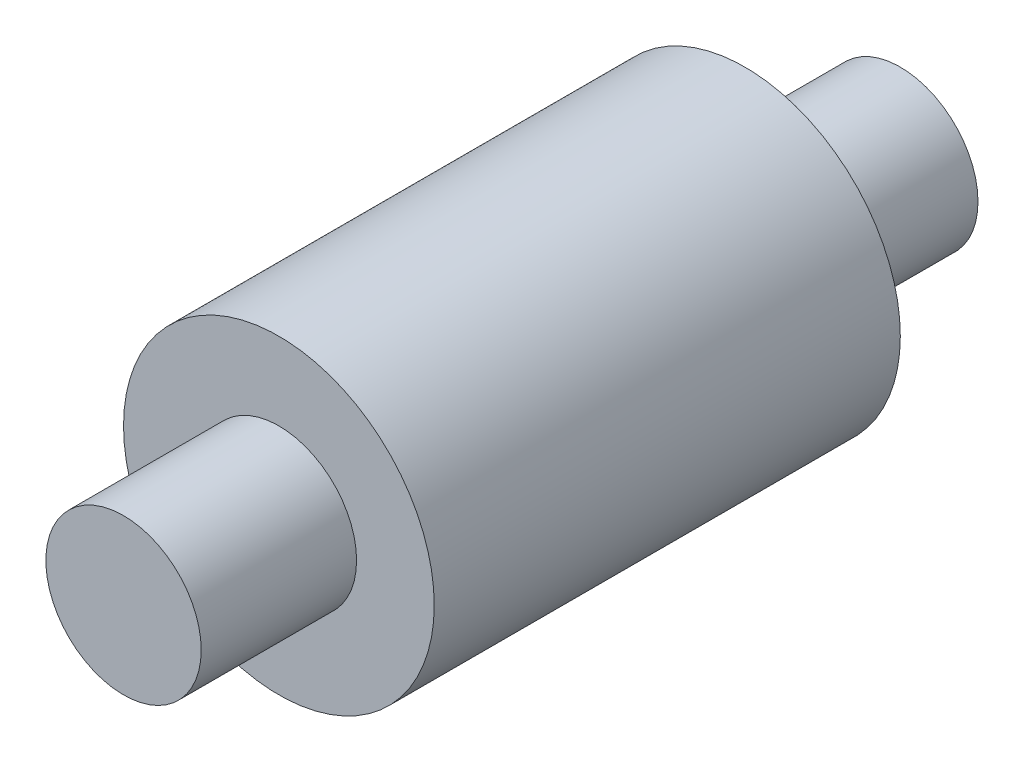
ISO-10303-21;
HEADER;
FILE_DESCRIPTION(('STEP AP214'),'2;1');
FILE_NAME('part.step','',(''),(''),'','','');
FILE_SCHEMA(('AUTOMOTIVE_DESIGN { 1 0 10303 214 1 1 1 1 }'));
ENDSEC;
DATA;
#1=APPLICATION_CONTEXT('core data for automotive mechanical design processes');
#2=APPLICATION_PROTOCOL_DEFINITION('international standard','automotive_design',2000,#1);
#3=PRODUCT_CONTEXT('',#1,'mechanical');
#4=PRODUCT('Part','Part','',(#3));
#5=PRODUCT_RELATED_PRODUCT_CATEGORY('part','',(#4));
#6=PRODUCT_DEFINITION_FORMATION('','',#4);
#7=PRODUCT_DEFINITION_CONTEXT('part definition',#1,'design');
#8=PRODUCT_DEFINITION('design','',#6,#7);
#9=PRODUCT_DEFINITION_SHAPE('','',#8);
#10=(LENGTH_UNIT() NAMED_UNIT(*) SI_UNIT(.MILLI.,.METRE.));
#11=(NAMED_UNIT(*) PLANE_ANGLE_UNIT() SI_UNIT($,.RADIAN.));
#12=(NAMED_UNIT(*) SI_UNIT($,.STERADIAN.) SOLID_ANGLE_UNIT());
#13=UNCERTAINTY_MEASURE_WITH_UNIT(LENGTH_MEASURE(1.E-05),#10,'distance_accuracy_value','');
#14=(GEOMETRIC_REPRESENTATION_CONTEXT(3) GLOBAL_UNCERTAINTY_ASSIGNED_CONTEXT((#13)) GLOBAL_UNIT_ASSIGNED_CONTEXT((#10,
#11,#12)) REPRESENTATION_CONTEXT('',''));
#15=CARTESIAN_POINT('',(0.,0.,0.));
#16=DIRECTION('',(0.,0.,1.));
#17=DIRECTION('',(1.,0.,0.));
#18=AXIS2_PLACEMENT_3D('',#15,#16,#17);
#19=CARTESIAN_POINT('',(0.,0.,-5.));
#20=DIRECTION('',(0.,0.,1.));
#21=DIRECTION('',(1.,0.,0.));
#22=AXIS2_PLACEMENT_3D('',#19,#20,#21);
#23=CYLINDRICAL_SURFACE('',#22,1.);
#24=CARTESIAN_POINT('',(0.,0.,-5.));
#25=DIRECTION('',(0.,0.,1.));
#26=DIRECTION('',(1.,0.,0.));
#27=AXIS2_PLACEMENT_3D('',#24,#25,#26);
#28=CIRCLE('',#27,1.);
#29=CARTESIAN_POINT('',(1.,0.,-5.));
#30=VERTEX_POINT('',#29);
#31=EDGE_CURVE('E38',#30,#30,#28,.T.);
#32=ORIENTED_EDGE('',*,*,#31,.T.);
#33=EDGE_LOOP('',(#32));
#34=FACE_BOUND('',#33,.T.);
#35=CARTESIAN_POINT('',(0.,0.,-3.));
#36=DIRECTION('',(0.,0.,1.));
#37=DIRECTION('',(1.,0.,0.));
#38=AXIS2_PLACEMENT_3D('',#35,#36,#37);
#39=CIRCLE('',#38,1.);
#40=CARTESIAN_POINT('',(1.,0.,-3.));
#41=VERTEX_POINT('',#40);
#42=EDGE_CURVE('E34',#41,#41,#39,.F.);
#43=ORIENTED_EDGE('',*,*,#42,.T.);
#44=EDGE_LOOP('',(#43));
#45=FACE_BOUND('',#44,.T.);
#46=ADVANCED_FACE('F30',(#34,#45),#23,.T.);
#47=CARTESIAN_POINT('',(0.,0.,-5.));
#48=DIRECTION('',(0.,0.,1.));
#49=DIRECTION('',(1.,0.,0.));
#50=AXIS2_PLACEMENT_3D('',#47,#48,#49);
#51=PLANE('',#50);
#52=ORIENTED_EDGE('',*,*,#31,.F.);
#53=EDGE_LOOP('',(#52));
#54=FACE_BOUND('',#53,.T.);
#55=ADVANCED_FACE('F59',(#54),#51,.F.);
#56=CARTESIAN_POINT('',(0.,0.,-3.));
#57=DIRECTION('',(0.,0.,1.));
#58=DIRECTION('',(1.,0.,0.));
#59=AXIS2_PLACEMENT_3D('',#56,#57,#58);
#60=CYLINDRICAL_SURFACE('',#59,2.);
#61=CARTESIAN_POINT('',(0.,0.,-3.));
#62=DIRECTION('',(0.,0.,1.));
#63=DIRECTION('',(1.,0.,0.));
#64=AXIS2_PLACEMENT_3D('',#61,#62,#63);
#65=CIRCLE('',#64,2.);
#66=CARTESIAN_POINT('',(2.,0.,-3.));
#67=VERTEX_POINT('',#66);
#68=EDGE_CURVE('E47',#67,#67,#65,.T.);
#69=ORIENTED_EDGE('',*,*,#68,.T.);
#70=EDGE_LOOP('',(#69));
#71=FACE_BOUND('',#70,.T.);
#72=CARTESIAN_POINT('',(0.,0.,3.));
#73=DIRECTION('',(0.,0.,1.));
#74=DIRECTION('',(1.,0.,0.));
#75=AXIS2_PLACEMENT_3D('',#72,#73,#74);
#76=CIRCLE('',#75,2.);
#77=CARTESIAN_POINT('',(2.,0.,3.));
#78=VERTEX_POINT('',#77);
#79=EDGE_CURVE('E50',#78,#78,#76,.T.);
#80=ORIENTED_EDGE('',*,*,#79,.F.);
#81=EDGE_LOOP('',(#80));
#82=FACE_BOUND('',#81,.T.);
#83=ADVANCED_FACE('F56',(#71,#82),#60,.T.);
#84=CARTESIAN_POINT('',(0.,0.,-3.));
#85=DIRECTION('',(0.,0.,1.));
#86=DIRECTION('',(1.,0.,0.));
#87=AXIS2_PLACEMENT_3D('',#84,#85,#86);
#88=PLANE('',#87);
#89=ORIENTED_EDGE('',*,*,#42,.F.);
#90=EDGE_LOOP('',(#89));
#91=FACE_BOUND('',#90,.T.);
#92=ORIENTED_EDGE('',*,*,#68,.F.);
#93=EDGE_LOOP('',(#92));
#94=FACE_BOUND('',#93,.T.);
#95=ADVANCED_FACE('F58',(#91,#94),#88,.F.);
#96=CARTESIAN_POINT('',(0.,0.,3.));
#97=DIRECTION('',(0.,0.,1.));
#98=DIRECTION('',(1.,0.,0.));
#99=AXIS2_PLACEMENT_3D('',#96,#97,#98);
#100=PLANE('',#99);
#101=CARTESIAN_POINT('',(0.,0.,3.));
#102=DIRECTION('',(0.,0.,1.));
#103=DIRECTION('',(1.,0.,0.));
#104=AXIS2_PLACEMENT_3D('',#101,#102,#103);
#105=CIRCLE('',#104,1.);
#106=CARTESIAN_POINT('',(1.,0.,3.));
#107=VERTEX_POINT('',#106);
#108=EDGE_CURVE('E10',#107,#107,#105,.F.);
#109=ORIENTED_EDGE('',*,*,#108,.T.);
#110=EDGE_LOOP('',(#109));
#111=FACE_BOUND('',#110,.T.);
#112=ORIENTED_EDGE('',*,*,#79,.T.);
#113=EDGE_LOOP('',(#112));
#114=FACE_BOUND('',#113,.T.);
#115=ADVANCED_FACE('F54',(#111,#114),#100,.T.);
#116=CARTESIAN_POINT('',(0.,0.,5.));
#117=DIRECTION('',(0.,0.,1.));
#118=DIRECTION('',(1.,0.,0.));
#119=AXIS2_PLACEMENT_3D('',#116,#117,#118);
#120=PLANE('',#119);
#121=CARTESIAN_POINT('',(0.,0.,5.));
#122=DIRECTION('',(0.,0.,1.));
#123=DIRECTION('',(1.,0.,0.));
#124=AXIS2_PLACEMENT_3D('',#121,#122,#123);
#125=CIRCLE('',#124,1.);
#126=CARTESIAN_POINT('',(1.,0.,5.));
#127=VERTEX_POINT('',#126);
#128=EDGE_CURVE('E42',#127,#127,#125,.T.);
#129=ORIENTED_EDGE('',*,*,#128,.T.);
#130=EDGE_LOOP('',(#129));
#131=FACE_BOUND('',#130,.T.);
#132=ADVANCED_FACE('F76',(#131),#120,.T.);
#133=ORIENTED_EDGE('',*,*,#108,.F.);
#134=EDGE_LOOP('',(#133));
#135=FACE_BOUND('',#134,.T.);
#136=ORIENTED_EDGE('',*,*,#128,.F.);
#137=EDGE_LOOP('',(#136));
#138=FACE_BOUND('',#137,.T.);
#139=ADVANCED_FACE('F32',(#135,#138),#23,.T.);
#140=CLOSED_SHELL('',(#46,#55,#83,#95,#115,#132,#139));
#141=MANIFOLD_SOLID_BREP('B2',#140);
#142=ADVANCED_BREP_SHAPE_REPRESENTATION('',(#18,#141),#14);
#143=SHAPE_DEFINITION_REPRESENTATION(#9,#142);
ENDSEC;
END-ISO-10303-21;
